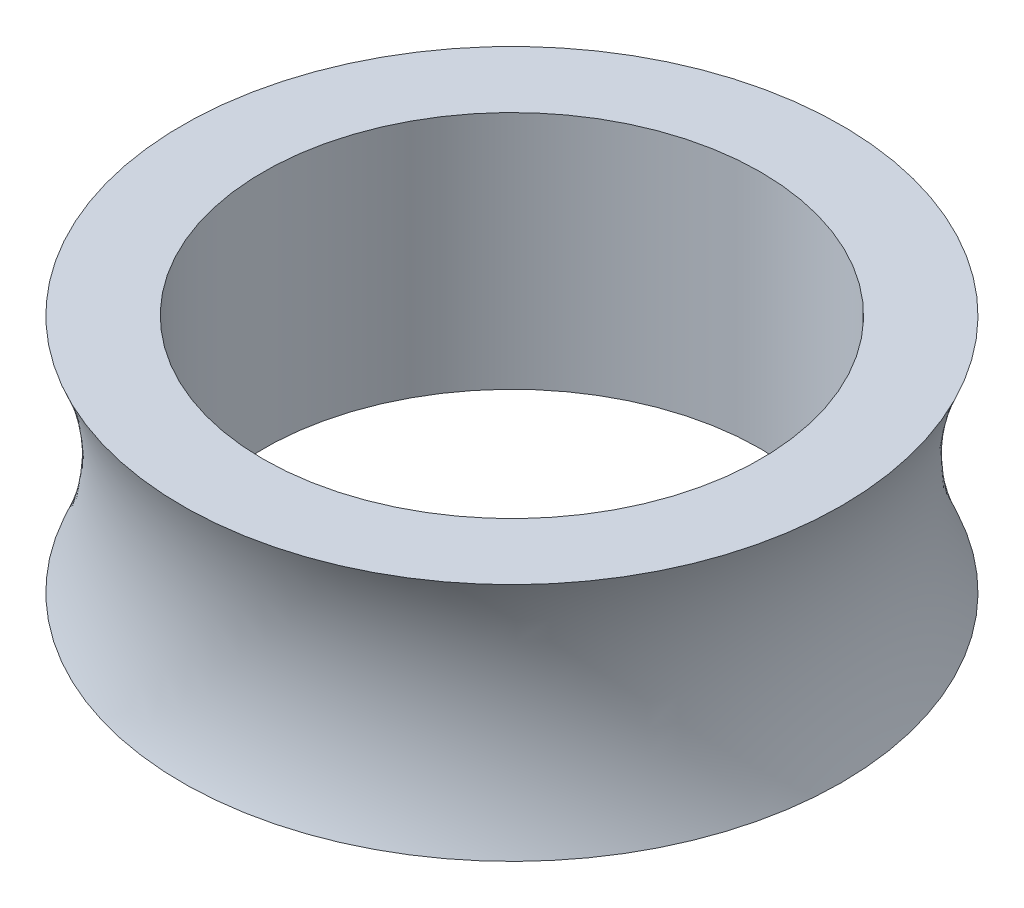
ISO-10303-21;
HEADER;
FILE_DESCRIPTION(('STEP AP214'),'2;1');
FILE_NAME('part.step','',(''),(''),'','','');
FILE_SCHEMA(('AUTOMOTIVE_DESIGN { 1 0 10303 214 1 1 1 1 }'));
ENDSEC;
DATA;
#1=APPLICATION_CONTEXT('core data for automotive mechanical design processes');
#2=APPLICATION_PROTOCOL_DEFINITION('international standard','automotive_design',2000,#1);
#3=PRODUCT_CONTEXT('',#1,'mechanical');
#4=PRODUCT('Part','Part','',(#3));
#5=PRODUCT_RELATED_PRODUCT_CATEGORY('part','',(#4));
#6=PRODUCT_DEFINITION_FORMATION('','',#4);
#7=PRODUCT_DEFINITION_CONTEXT('part definition',#1,'design');
#8=PRODUCT_DEFINITION('design','',#6,#7);
#9=PRODUCT_DEFINITION_SHAPE('','',#8);
#10=(LENGTH_UNIT() NAMED_UNIT(*) SI_UNIT(.MILLI.,.METRE.));
#11=(NAMED_UNIT(*) PLANE_ANGLE_UNIT() SI_UNIT($,.RADIAN.));
#12=(NAMED_UNIT(*) SI_UNIT($,.STERADIAN.) SOLID_ANGLE_UNIT());
#13=UNCERTAINTY_MEASURE_WITH_UNIT(LENGTH_MEASURE(1.E-05),#10,'distance_accuracy_value','');
#14=(GEOMETRIC_REPRESENTATION_CONTEXT(3) GLOBAL_UNCERTAINTY_ASSIGNED_CONTEXT((#13)) GLOBAL_UNIT_ASSIGNED_CONTEXT((#10,
#11,#12)) REPRESENTATION_CONTEXT('',''));
#15=CARTESIAN_POINT('',(0.,0.,0.));
#16=DIRECTION('',(0.,0.,1.));
#17=DIRECTION('',(1.,0.,0.));
#18=AXIS2_PLACEMENT_3D('',#15,#16,#17);
#19=CARTESIAN_POINT('',(0.,4.,0.));
#20=DIRECTION('',(0.,1.,0.));
#21=DIRECTION('',(0.,0.,1.));
#22=AXIS2_PLACEMENT_3D('',#19,#20,#21);
#23=PLANE('',#22);
#24=CARTESIAN_POINT('',(0.,4.,0.));
#25=DIRECTION('',(0.,1.,0.));
#26=DIRECTION('',(0.,0.,1.));
#27=AXIS2_PLACEMENT_3D('',#24,#25,#26);
#28=CIRCLE('',#27,4.15);
#29=CARTESIAN_POINT('',(0.,4.,4.15));
#30=VERTEX_POINT('',#29);
#31=EDGE_CURVE('E60',#30,#30,#28,.T.);
#32=ORIENTED_EDGE('',*,*,#31,.F.);
#33=EDGE_LOOP('',(#32));
#34=FACE_BOUND('',#33,.T.);
#35=CARTESIAN_POINT('',(0.,4.,0.));
#36=DIRECTION('',(0.,1.,0.));
#37=DIRECTION('',(0.,0.,1.));
#38=AXIS2_PLACEMENT_3D('',#35,#36,#37);
#39=CIRCLE('',#38,5.5);
#40=CARTESIAN_POINT('',(5.5,4.,0.));
#41=VERTEX_POINT('',#40);
#42=EDGE_CURVE('E11',#41,#41,#39,.T.);
#43=ORIENTED_EDGE('',*,*,#42,.T.);
#44=EDGE_LOOP('',(#43));
#45=FACE_BOUND('',#44,.T.);
#46=ADVANCED_FACE('F39',(#34,#45),#23,.T.);
#47=CARTESIAN_POINT('',(0.,0.,0.));
#48=DIRECTION('',(0.,1.,0.));
#49=DIRECTION('',(0.,0.,1.));
#50=AXIS2_PLACEMENT_3D('',#47,#48,#49);
#51=PLANE('',#50);
#52=CARTESIAN_POINT('',(0.,0.,0.));
#53=DIRECTION('',(0.,1.,0.));
#54=DIRECTION('',(0.,0.,1.));
#55=AXIS2_PLACEMENT_3D('',#52,#53,#54);
#56=CIRCLE('',#55,4.15);
#57=CARTESIAN_POINT('',(0.,0.,4.15));
#58=VERTEX_POINT('',#57);
#59=EDGE_CURVE('E63',#58,#58,#56,.T.);
#60=ORIENTED_EDGE('',*,*,#59,.T.);
#61=EDGE_LOOP('',(#60));
#62=FACE_BOUND('',#61,.T.);
#63=CARTESIAN_POINT('',(0.,0.,0.));
#64=DIRECTION('',(0.,1.,0.));
#65=DIRECTION('',(0.,0.,1.));
#66=AXIS2_PLACEMENT_3D('',#63,#64,#65);
#67=CIRCLE('',#66,5.5);
#68=CARTESIAN_POINT('',(5.5,0.,0.));
#69=VERTEX_POINT('',#68);
#70=EDGE_CURVE('E43',#69,#69,#67,.T.);
#71=ORIENTED_EDGE('',*,*,#70,.F.);
#72=EDGE_LOOP('',(#71));
#73=FACE_BOUND('',#72,.T.);
#74=ADVANCED_FACE('F41',(#62,#73),#51,.F.);
#75=CARTESIAN_POINT('',(0.,4.,0.));
#76=DIRECTION('',(0.,-1.,0.));
#77=DIRECTION('',(0.,0.,-1.));
#78=AXIS2_PLACEMENT_3D('',#75,#76,#77);
#79=CYLINDRICAL_SURFACE('',#78,4.15);
#80=ORIENTED_EDGE('',*,*,#31,.T.);
#81=EDGE_LOOP('',(#80));
#82=FACE_BOUND('',#81,.T.);
#83=ORIENTED_EDGE('',*,*,#59,.F.);
#84=EDGE_LOOP('',(#83));
#85=FACE_BOUND('',#84,.T.);
#86=ADVANCED_FACE('F75',(#82,#85),#79,.F.);
#87=CARTESIAN_POINT('',(0.,2.,0.));
#88=DIRECTION('',(0.,1.,0.));
#89=DIRECTION('',(0.,0.,1.));
#90=AXIS2_PLACEMENT_3D('',#87,#88,#89);
#91=TOROIDAL_SURFACE('',#90,9.91351725233926,4.84552727127774);
#92=CARTESIAN_POINT('',(9.91351725233926,2.,0.));
#93=DIRECTION('',(0.,0.,1.));
#94=DIRECTION('',(1.,0.,0.));
#95=AXIS2_PLACEMENT_3D('',#92,#93,#94);
#96=CIRCLE('',#95,4.84552727127774);
#97=EDGE_CURVE('E57',#41,#69,#96,.T.);
#98=ORIENTED_EDGE('',*,*,#97,.F.);
#99=ORIENTED_EDGE('',*,*,#42,.F.);
#100=ORIENTED_EDGE('',*,*,#97,.T.);
#101=ORIENTED_EDGE('',*,*,#70,.T.);
#102=EDGE_LOOP('',(#98,#99,#100,#101));
#103=FACE_BOUND('',#102,.T.);
#104=ADVANCED_FACE('F56',(#103),#91,.F.);
#105=CLOSED_SHELL('',(#46,#74,#86,#104));
#106=MANIFOLD_SOLID_BREP('B2',#105);
#107=ADVANCED_BREP_SHAPE_REPRESENTATION('',(#18,#106),#14);
#108=SHAPE_DEFINITION_REPRESENTATION(#9,#107);
ENDSEC;
END-ISO-10303-21;
